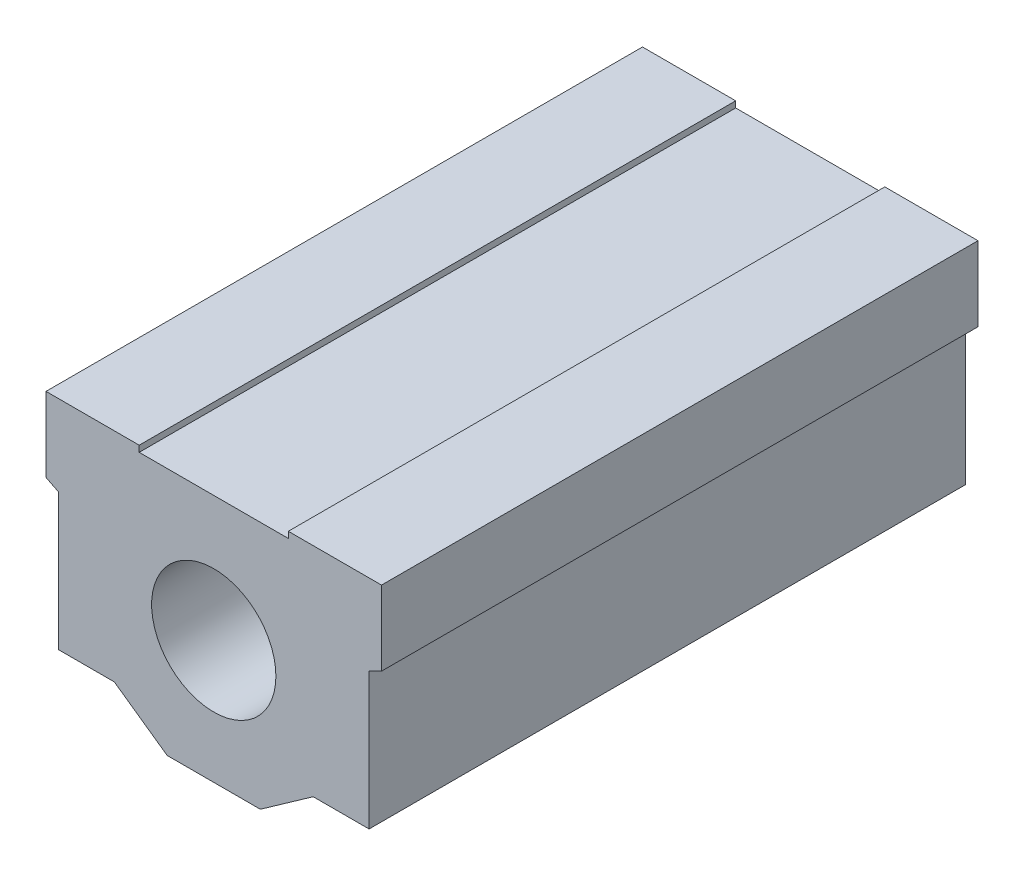
ISO-10303-21;
HEADER;
FILE_DESCRIPTION(('STEP AP214'),'2;1');
FILE_NAME('part.step','',(''),(''),'','','');
FILE_SCHEMA(('AUTOMOTIVE_DESIGN { 1 0 10303 214 1 1 1 1 }'));
ENDSEC;
DATA;
#1=APPLICATION_CONTEXT('core data for automotive mechanical design processes');
#2=APPLICATION_PROTOCOL_DEFINITION('international standard','automotive_design',2000,#1);
#3=PRODUCT_CONTEXT('',#1,'mechanical');
#4=PRODUCT('Part','Part','',(#3));
#5=PRODUCT_RELATED_PRODUCT_CATEGORY('part','',(#4));
#6=PRODUCT_DEFINITION_FORMATION('','',#4);
#7=PRODUCT_DEFINITION_CONTEXT('part definition',#1,'design');
#8=PRODUCT_DEFINITION('design','',#6,#7);
#9=PRODUCT_DEFINITION_SHAPE('','',#8);
#10=(LENGTH_UNIT() NAMED_UNIT(*) SI_UNIT(.MILLI.,.METRE.));
#11=(NAMED_UNIT(*) PLANE_ANGLE_UNIT() SI_UNIT($,.RADIAN.));
#12=(NAMED_UNIT(*) SI_UNIT($,.STERADIAN.) SOLID_ANGLE_UNIT());
#13=UNCERTAINTY_MEASURE_WITH_UNIT(LENGTH_MEASURE(1.E-05),#10,'distance_accuracy_value','');
#14=(GEOMETRIC_REPRESENTATION_CONTEXT(3) GLOBAL_UNCERTAINTY_ASSIGNED_CONTEXT((#13)) GLOBAL_UNIT_ASSIGNED_CONTEXT((#10,
#11,#12)) REPRESENTATION_CONTEXT('',''));
#15=CARTESIAN_POINT('',(0.,0.,0.));
#16=DIRECTION('',(0.,0.,1.));
#17=DIRECTION('',(1.,0.,0.));
#18=AXIS2_PLACEMENT_3D('',#15,#16,#17);
#19=CARTESIAN_POINT('',(0.,0.,96.));
#20=DIRECTION('',(0.,0.,-1.));
#21=DIRECTION('',(-1.,0.,0.));
#22=AXIS2_PLACEMENT_3D('',#19,#20,#21);
#23=PLANE('',#22);
#24=DIRECTION('',(0.816967863264762,-0.576683197598654,0.));
#25=VECTOR('',#24,1.);
#26=CARTESIAN_POINT('',(-7.49999999999999,0.,96.));
#27=LINE('',#26,#25);
#28=CARTESIAN_POINT('',(-16.,5.99999999999999,96.));
#29=VERTEX_POINT('',#28);
#30=CARTESIAN_POINT('',(-7.49999999999999,0.,96.));
#31=VERTEX_POINT('',#30);
#32=EDGE_CURVE('E236',#29,#31,#27,.T.);
#33=ORIENTED_EDGE('',*,*,#32,.T.);
#34=DIRECTION('',(1.,0.,0.));
#35=VECTOR('',#34,1.);
#36=CARTESIAN_POINT('',(7.50000000000001,0.,96.));
#37=LINE('',#36,#35);
#38=CARTESIAN_POINT('',(7.50000000000001,0.,96.));
#39=VERTEX_POINT('',#38);
#40=EDGE_CURVE('E124',#31,#39,#37,.T.);
#41=ORIENTED_EDGE('',*,*,#40,.T.);
#42=DIRECTION('',(0.816967863264762,0.576683197598655,0.));
#43=VECTOR('',#42,1.);
#44=CARTESIAN_POINT('',(7.50000000000001,0.,96.));
#45=LINE('',#44,#43);
#46=CARTESIAN_POINT('',(16.,5.99999999999999,96.));
#47=VERTEX_POINT('',#46);
#48=EDGE_CURVE('E289',#39,#47,#45,.T.);
#49=ORIENTED_EDGE('',*,*,#48,.T.);
#50=DIRECTION('',(1.,0.,0.));
#51=VECTOR('',#50,1.);
#52=CARTESIAN_POINT('',(16.,5.99999999999999,96.));
#53=LINE('',#52,#51);
#54=CARTESIAN_POINT('',(25.,5.99999999999999,96.));
#55=VERTEX_POINT('',#54);
#56=EDGE_CURVE('E309',#47,#55,#53,.T.);
#57=ORIENTED_EDGE('',*,*,#56,.T.);
#58=DIRECTION('',(0.,1.,0.));
#59=VECTOR('',#58,1.);
#60=CARTESIAN_POINT('',(25.,5.99999999999999,96.));
#61=LINE('',#60,#59);
#62=CARTESIAN_POINT('',(25.,28.,96.));
#63=VERTEX_POINT('',#62);
#64=EDGE_CURVE('E305',#55,#63,#61,.T.);
#65=ORIENTED_EDGE('',*,*,#64,.T.);
#66=DIRECTION('',(0.894427190999913,0.447213595499964,0.));
#67=VECTOR('',#66,1.);
#68=CARTESIAN_POINT('',(25.,28.,96.));
#69=LINE('',#68,#67);
#70=CARTESIAN_POINT('',(27.,29.,96.));
#71=VERTEX_POINT('',#70);
#72=EDGE_CURVE('E308',#63,#71,#69,.T.);
#73=ORIENTED_EDGE('',*,*,#72,.T.);
#74=DIRECTION('',(0.,1.,0.));
#75=VECTOR('',#74,1.);
#76=CARTESIAN_POINT('',(27.,29.,96.));
#77=LINE('',#76,#75);
#78=CARTESIAN_POINT('',(27.,41.,96.));
#79=VERTEX_POINT('',#78);
#80=EDGE_CURVE('E313',#71,#79,#77,.T.);
#81=ORIENTED_EDGE('',*,*,#80,.T.);
#82=DIRECTION('',(-1.,0.,0.));
#83=VECTOR('',#82,1.);
#84=CARTESIAN_POINT('',(27.,41.,96.));
#85=LINE('',#84,#83);
#86=CARTESIAN_POINT('',(12.,41.,96.));
#87=VERTEX_POINT('',#86);
#88=EDGE_CURVE('E320',#79,#87,#85,.T.);
#89=ORIENTED_EDGE('',*,*,#88,.T.);
#90=DIRECTION('',(0.,-1.,0.));
#91=VECTOR('',#90,1.);
#92=CARTESIAN_POINT('',(12.,41.,96.));
#93=LINE('',#92,#91);
#94=CARTESIAN_POINT('',(12.,40.,96.));
#95=VERTEX_POINT('',#94);
#96=EDGE_CURVE('E323',#87,#95,#93,.T.);
#97=ORIENTED_EDGE('',*,*,#96,.T.);
#98=DIRECTION('',(-1.,0.,0.));
#99=VECTOR('',#98,1.);
#100=CARTESIAN_POINT('',(-12.,40.,96.));
#101=LINE('',#100,#99);
#102=CARTESIAN_POINT('',(-12.,40.,96.));
#103=VERTEX_POINT('',#102);
#104=EDGE_CURVE('E326',#95,#103,#101,.T.);
#105=ORIENTED_EDGE('',*,*,#104,.T.);
#106=DIRECTION('',(0.,1.,0.));
#107=VECTOR('',#106,1.);
#108=CARTESIAN_POINT('',(-12.,41.,96.));
#109=LINE('',#108,#107);
#110=CARTESIAN_POINT('',(-12.,41.,96.));
#111=VERTEX_POINT('',#110);
#112=EDGE_CURVE('E329',#103,#111,#109,.T.);
#113=ORIENTED_EDGE('',*,*,#112,.T.);
#114=DIRECTION('',(-1.,0.,0.));
#115=VECTOR('',#114,1.);
#116=CARTESIAN_POINT('',(-27.,41.,96.));
#117=LINE('',#116,#115);
#118=CARTESIAN_POINT('',(-27.,41.,96.));
#119=VERTEX_POINT('',#118);
#120=EDGE_CURVE('E332',#111,#119,#117,.T.);
#121=ORIENTED_EDGE('',*,*,#120,.T.);
#122=DIRECTION('',(0.,-1.,0.));
#123=VECTOR('',#122,1.);
#124=CARTESIAN_POINT('',(-27.,29.,96.));
#125=LINE('',#124,#123);
#126=CARTESIAN_POINT('',(-27.,29.,96.));
#127=VERTEX_POINT('',#126);
#128=EDGE_CURVE('E167',#119,#127,#125,.T.);
#129=ORIENTED_EDGE('',*,*,#128,.T.);
#130=DIRECTION('',(0.894427190999913,-0.447213595499964,0.));
#131=VECTOR('',#130,1.);
#132=CARTESIAN_POINT('',(-25.,28.,96.));
#133=LINE('',#132,#131);
#134=CARTESIAN_POINT('',(-25.,28.,96.));
#135=VERTEX_POINT('',#134);
#136=EDGE_CURVE('E161',#127,#135,#133,.T.);
#137=ORIENTED_EDGE('',*,*,#136,.T.);
#138=DIRECTION('',(0.,-1.,0.));
#139=VECTOR('',#138,1.);
#140=CARTESIAN_POINT('',(-25.,5.99999999999999,96.));
#141=LINE('',#140,#139);
#142=CARTESIAN_POINT('',(-25.,5.99999999999999,96.));
#143=VERTEX_POINT('',#142);
#144=EDGE_CURVE('E165',#135,#143,#141,.T.);
#145=ORIENTED_EDGE('',*,*,#144,.T.);
#146=DIRECTION('',(1.,0.,0.));
#147=VECTOR('',#146,1.);
#148=CARTESIAN_POINT('',(-16.,5.99999999999999,96.));
#149=LINE('',#148,#147);
#150=EDGE_CURVE('E57',#143,#29,#149,.T.);
#151=ORIENTED_EDGE('',*,*,#150,.T.);
#152=EDGE_LOOP('',(#33,#41,#49,#57,#65,#73,#81,#89,#97,#105,#113,#121,#129,#137,#145,#151));
#153=FACE_BOUND('',#152,.T.);
#154=CARTESIAN_POINT('',(0.,19.8,96.));
#155=DIRECTION('',(0.,0.,1.));
#156=DIRECTION('',(1.,0.,0.));
#157=AXIS2_PLACEMENT_3D('',#154,#155,#156);
#158=CIRCLE('',#157,10.);
#159=CARTESIAN_POINT('',(10.,19.8,96.));
#160=VERTEX_POINT('',#159);
#161=EDGE_CURVE('E194',#160,#160,#158,.T.);
#162=ORIENTED_EDGE('',*,*,#161,.F.);
#163=EDGE_LOOP('',(#162));
#164=FACE_BOUND('',#163,.T.);
#165=ADVANCED_FACE('F39',(#153,#164),#23,.F.);
#166=CARTESIAN_POINT('',(0.,0.,0.));
#167=DIRECTION('',(0.,0.,-1.));
#168=DIRECTION('',(-1.,0.,0.));
#169=AXIS2_PLACEMENT_3D('',#166,#167,#168);
#170=PLANE('',#169);
#171=DIRECTION('',(0.816967863264762,-0.576683197598654,0.));
#172=VECTOR('',#171,1.);
#173=CARTESIAN_POINT('',(-7.49999999999999,0.,0.));
#174=LINE('',#173,#172);
#175=CARTESIAN_POINT('',(-16.,5.99999999999999,0.));
#176=VERTEX_POINT('',#175);
#177=CARTESIAN_POINT('',(-7.49999999999999,0.,0.));
#178=VERTEX_POINT('',#177);
#179=EDGE_CURVE('E189',#176,#178,#174,.T.);
#180=ORIENTED_EDGE('',*,*,#179,.F.);
#181=DIRECTION('',(1.,0.,0.));
#182=VECTOR('',#181,1.);
#183=CARTESIAN_POINT('',(-16.,5.99999999999999,0.));
#184=LINE('',#183,#182);
#185=CARTESIAN_POINT('',(-25.,5.99999999999999,0.));
#186=VERTEX_POINT('',#185);
#187=EDGE_CURVE('E116',#186,#176,#184,.T.);
#188=ORIENTED_EDGE('',*,*,#187,.F.);
#189=DIRECTION('',(0.,-1.,0.));
#190=VECTOR('',#189,1.);
#191=CARTESIAN_POINT('',(-25.,5.99999999999999,0.));
#192=LINE('',#191,#190);
#193=CARTESIAN_POINT('',(-25.,28.,0.));
#194=VERTEX_POINT('',#193);
#195=EDGE_CURVE('E110',#194,#186,#192,.T.);
#196=ORIENTED_EDGE('',*,*,#195,.F.);
#197=DIRECTION('',(0.894427190999913,-0.447213595499964,0.));
#198=VECTOR('',#197,1.);
#199=CARTESIAN_POINT('',(-25.,28.,0.));
#200=LINE('',#199,#198);
#201=CARTESIAN_POINT('',(-27.,29.,0.));
#202=VERTEX_POINT('',#201);
#203=EDGE_CURVE('E176',#202,#194,#200,.T.);
#204=ORIENTED_EDGE('',*,*,#203,.F.);
#205=DIRECTION('',(0.,-1.,0.));
#206=VECTOR('',#205,1.);
#207=CARTESIAN_POINT('',(-27.,29.,0.));
#208=LINE('',#207,#206);
#209=CARTESIAN_POINT('',(-27.,41.,0.));
#210=VERTEX_POINT('',#209);
#211=EDGE_CURVE('E227',#210,#202,#208,.T.);
#212=ORIENTED_EDGE('',*,*,#211,.F.);
#213=DIRECTION('',(-1.,0.,0.));
#214=VECTOR('',#213,1.);
#215=CARTESIAN_POINT('',(-27.,41.,0.));
#216=LINE('',#215,#214);
#217=CARTESIAN_POINT('',(-12.,41.,0.));
#218=VERTEX_POINT('',#217);
#219=EDGE_CURVE('E224',#218,#210,#216,.T.);
#220=ORIENTED_EDGE('',*,*,#219,.F.);
#221=DIRECTION('',(0.,1.,0.));
#222=VECTOR('',#221,1.);
#223=CARTESIAN_POINT('',(-12.,41.,0.));
#224=LINE('',#223,#222);
#225=CARTESIAN_POINT('',(-12.,40.,0.));
#226=VERTEX_POINT('',#225);
#227=EDGE_CURVE('E221',#226,#218,#224,.T.);
#228=ORIENTED_EDGE('',*,*,#227,.F.);
#229=DIRECTION('',(-1.,0.,0.));
#230=VECTOR('',#229,1.);
#231=CARTESIAN_POINT('',(-12.,40.,0.));
#232=LINE('',#231,#230);
#233=CARTESIAN_POINT('',(12.,40.,0.));
#234=VERTEX_POINT('',#233);
#235=EDGE_CURVE('E218',#234,#226,#232,.T.);
#236=ORIENTED_EDGE('',*,*,#235,.F.);
#237=DIRECTION('',(0.,-1.,0.));
#238=VECTOR('',#237,1.);
#239=CARTESIAN_POINT('',(12.,41.,0.));
#240=LINE('',#239,#238);
#241=CARTESIAN_POINT('',(12.,41.,0.));
#242=VERTEX_POINT('',#241);
#243=EDGE_CURVE('E215',#242,#234,#240,.T.);
#244=ORIENTED_EDGE('',*,*,#243,.F.);
#245=DIRECTION('',(-1.,0.,0.));
#246=VECTOR('',#245,1.);
#247=CARTESIAN_POINT('',(27.,41.,0.));
#248=LINE('',#247,#246);
#249=CARTESIAN_POINT('',(27.,41.,0.));
#250=VERTEX_POINT('',#249);
#251=EDGE_CURVE('E212',#250,#242,#248,.T.);
#252=ORIENTED_EDGE('',*,*,#251,.F.);
#253=DIRECTION('',(0.,1.,0.));
#254=VECTOR('',#253,1.);
#255=CARTESIAN_POINT('',(27.,29.,0.));
#256=LINE('',#255,#254);
#257=CARTESIAN_POINT('',(27.,29.,0.));
#258=VERTEX_POINT('',#257);
#259=EDGE_CURVE('E209',#258,#250,#256,.T.);
#260=ORIENTED_EDGE('',*,*,#259,.F.);
#261=DIRECTION('',(0.894427190999913,0.447213595499964,0.));
#262=VECTOR('',#261,1.);
#263=CARTESIAN_POINT('',(25.,28.,0.));
#264=LINE('',#263,#262);
#265=CARTESIAN_POINT('',(25.,28.,0.));
#266=VERTEX_POINT('',#265);
#267=EDGE_CURVE('E206',#266,#258,#264,.T.);
#268=ORIENTED_EDGE('',*,*,#267,.F.);
#269=DIRECTION('',(0.,1.,0.));
#270=VECTOR('',#269,1.);
#271=CARTESIAN_POINT('',(25.,5.99999999999999,0.));
#272=LINE('',#271,#270);
#273=CARTESIAN_POINT('',(25.,5.99999999999999,0.));
#274=VERTEX_POINT('',#273);
#275=EDGE_CURVE('E203',#274,#266,#272,.T.);
#276=ORIENTED_EDGE('',*,*,#275,.F.);
#277=DIRECTION('',(1.,0.,0.));
#278=VECTOR('',#277,1.);
#279=CARTESIAN_POINT('',(16.,5.99999999999999,0.));
#280=LINE('',#279,#278);
#281=CARTESIAN_POINT('',(16.,5.99999999999999,0.));
#282=VERTEX_POINT('',#281);
#283=EDGE_CURVE('E200',#282,#274,#280,.T.);
#284=ORIENTED_EDGE('',*,*,#283,.F.);
#285=DIRECTION('',(0.816967863264762,0.576683197598655,0.));
#286=VECTOR('',#285,1.);
#287=CARTESIAN_POINT('',(7.50000000000001,0.,0.));
#288=LINE('',#287,#286);
#289=CARTESIAN_POINT('',(7.50000000000001,0.,0.));
#290=VERTEX_POINT('',#289);
#291=EDGE_CURVE('E197',#290,#282,#288,.T.);
#292=ORIENTED_EDGE('',*,*,#291,.F.);
#293=DIRECTION('',(1.,0.,0.));
#294=VECTOR('',#293,1.);
#295=CARTESIAN_POINT('',(7.50000000000001,0.,0.));
#296=LINE('',#295,#294);
#297=EDGE_CURVE('E193',#178,#290,#296,.T.);
#298=ORIENTED_EDGE('',*,*,#297,.F.);
#299=EDGE_LOOP('',(#180,#188,#196,#204,#212,#220,#228,#236,#244,#252,#260,#268,#276,#284,#292,#298));
#300=FACE_BOUND('',#299,.T.);
#301=CARTESIAN_POINT('',(0.,19.8,0.));
#302=DIRECTION('',(0.,0.,1.));
#303=DIRECTION('',(1.,0.,0.));
#304=AXIS2_PLACEMENT_3D('',#301,#302,#303);
#305=CIRCLE('',#304,10.);
#306=CARTESIAN_POINT('',(10.,19.8,0.));
#307=VERTEX_POINT('',#306);
#308=EDGE_CURVE('E533',#307,#307,#305,.T.);
#309=ORIENTED_EDGE('',*,*,#308,.T.);
#310=EDGE_LOOP('',(#309));
#311=FACE_BOUND('',#310,.T.);
#312=ADVANCED_FACE('F293',(#300,#311),#170,.T.);
#313=CARTESIAN_POINT('',(-7.49999999999999,0.,96.));
#314=DIRECTION('',(0.576683197598654,0.816967863264762,0.));
#315=DIRECTION('',(-0.816967863264762,0.576683197598654,0.));
#316=AXIS2_PLACEMENT_3D('',#313,#314,#315);
#317=PLANE('',#316);
#318=ORIENTED_EDGE('',*,*,#179,.T.);
#319=DIRECTION('',(0.,0.,-1.));
#320=VECTOR('',#319,1.);
#321=CARTESIAN_POINT('',(-7.49999999999999,0.,96.));
#322=LINE('',#321,#320);
#323=EDGE_CURVE('E11',#31,#178,#322,.T.);
#324=ORIENTED_EDGE('',*,*,#323,.F.);
#325=ORIENTED_EDGE('',*,*,#32,.F.);
#326=DIRECTION('',(0.,0.,-1.));
#327=VECTOR('',#326,1.);
#328=CARTESIAN_POINT('',(-16.,5.99999999999999,96.));
#329=LINE('',#328,#327);
#330=EDGE_CURVE('E185',#29,#176,#329,.T.);
#331=ORIENTED_EDGE('',*,*,#330,.T.);
#332=EDGE_LOOP('',(#318,#324,#325,#331));
#333=FACE_BOUND('',#332,.T.);
#334=ADVANCED_FACE('F41',(#333),#317,.F.);
#335=CARTESIAN_POINT('',(7.50000000000001,0.,96.));
#336=DIRECTION('',(0.,1.,0.));
#337=DIRECTION('',(-1.,0.,0.));
#338=AXIS2_PLACEMENT_3D('',#335,#336,#337);
#339=PLANE('',#338);
#340=ORIENTED_EDGE('',*,*,#297,.T.);
#341=DIRECTION('',(0.,0.,-1.));
#342=VECTOR('',#341,1.);
#343=CARTESIAN_POINT('',(7.50000000000001,0.,96.));
#344=LINE('',#343,#342);
#345=EDGE_CURVE('E49',#39,#290,#344,.T.);
#346=ORIENTED_EDGE('',*,*,#345,.F.);
#347=ORIENTED_EDGE('',*,*,#40,.F.);
#348=ORIENTED_EDGE('',*,*,#323,.T.);
#349=EDGE_LOOP('',(#340,#346,#347,#348));
#350=FACE_BOUND('',#349,.T.);
#351=ADVANCED_FACE('F368',(#350),#339,.F.);
#352=CARTESIAN_POINT('',(7.50000000000001,0.,96.));
#353=DIRECTION('',(-0.576683197598655,0.816967863264762,0.));
#354=DIRECTION('',(-0.816967863264762,-0.576683197598655,0.));
#355=AXIS2_PLACEMENT_3D('',#352,#353,#354);
#356=PLANE('',#355);
#357=ORIENTED_EDGE('',*,*,#291,.T.);
#358=DIRECTION('',(0.,0.,-1.));
#359=VECTOR('',#358,1.);
#360=CARTESIAN_POINT('',(16.,5.99999999999999,96.));
#361=LINE('',#360,#359);
#362=EDGE_CURVE('E279',#47,#282,#361,.T.);
#363=ORIENTED_EDGE('',*,*,#362,.F.);
#364=ORIENTED_EDGE('',*,*,#48,.F.);
#365=ORIENTED_EDGE('',*,*,#345,.T.);
#366=EDGE_LOOP('',(#357,#363,#364,#365));
#367=FACE_BOUND('',#366,.T.);
#368=ADVANCED_FACE('F287',(#367),#356,.F.);
#369=CARTESIAN_POINT('',(16.,5.99999999999999,96.));
#370=DIRECTION('',(0.,1.,0.));
#371=DIRECTION('',(-1.,0.,0.));
#372=AXIS2_PLACEMENT_3D('',#369,#370,#371);
#373=PLANE('',#372);
#374=ORIENTED_EDGE('',*,*,#283,.T.);
#375=DIRECTION('',(0.,0.,-1.));
#376=VECTOR('',#375,1.);
#377=CARTESIAN_POINT('',(25.,5.99999999999999,96.));
#378=LINE('',#377,#376);
#379=EDGE_CURVE('E275',#55,#274,#378,.T.);
#380=ORIENTED_EDGE('',*,*,#379,.F.);
#381=ORIENTED_EDGE('',*,*,#56,.F.);
#382=ORIENTED_EDGE('',*,*,#362,.T.);
#383=EDGE_LOOP('',(#374,#380,#381,#382));
#384=FACE_BOUND('',#383,.T.);
#385=ADVANCED_FACE('F299',(#384),#373,.F.);
#386=CARTESIAN_POINT('',(25.,5.99999999999999,96.));
#387=DIRECTION('',(-1.,0.,0.));
#388=DIRECTION('',(0.,-1.,0.));
#389=AXIS2_PLACEMENT_3D('',#386,#387,#388);
#390=PLANE('',#389);
#391=ORIENTED_EDGE('',*,*,#275,.T.);
#392=DIRECTION('',(0.,0.,-1.));
#393=VECTOR('',#392,1.);
#394=CARTESIAN_POINT('',(25.,28.,96.));
#395=LINE('',#394,#393);
#396=EDGE_CURVE('E271',#63,#266,#395,.T.);
#397=ORIENTED_EDGE('',*,*,#396,.F.);
#398=ORIENTED_EDGE('',*,*,#64,.F.);
#399=ORIENTED_EDGE('',*,*,#379,.T.);
#400=EDGE_LOOP('',(#391,#397,#398,#399));
#401=FACE_BOUND('',#400,.T.);
#402=ADVANCED_FACE('F303',(#401),#390,.F.);
#403=CARTESIAN_POINT('',(25.,28.,96.));
#404=DIRECTION('',(-0.447213595499964,0.894427190999913,0.));
#405=DIRECTION('',(-0.894427190999913,-0.447213595499964,0.));
#406=AXIS2_PLACEMENT_3D('',#403,#404,#405);
#407=PLANE('',#406);
#408=ORIENTED_EDGE('',*,*,#267,.T.);
#409=DIRECTION('',(0.,0.,-1.));
#410=VECTOR('',#409,1.);
#411=CARTESIAN_POINT('',(27.,29.,96.));
#412=LINE('',#411,#410);
#413=EDGE_CURVE('E267',#71,#258,#412,.T.);
#414=ORIENTED_EDGE('',*,*,#413,.F.);
#415=ORIENTED_EDGE('',*,*,#72,.F.);
#416=ORIENTED_EDGE('',*,*,#396,.T.);
#417=EDGE_LOOP('',(#408,#414,#415,#416));
#418=FACE_BOUND('',#417,.T.);
#419=ADVANCED_FACE('F381',(#418),#407,.F.);
#420=CARTESIAN_POINT('',(27.,29.,96.));
#421=DIRECTION('',(-1.,0.,0.));
#422=DIRECTION('',(0.,0.,1.));
#423=AXIS2_PLACEMENT_3D('',#420,#421,#422);
#424=PLANE('',#423);
#425=ORIENTED_EDGE('',*,*,#259,.T.);
#426=DIRECTION('',(0.,0.,-1.));
#427=VECTOR('',#426,1.);
#428=CARTESIAN_POINT('',(27.,41.,96.));
#429=LINE('',#428,#427);
#430=EDGE_CURVE('E263',#79,#250,#429,.T.);
#431=ORIENTED_EDGE('',*,*,#430,.F.);
#432=ORIENTED_EDGE('',*,*,#80,.F.);
#433=ORIENTED_EDGE('',*,*,#413,.T.);
#434=EDGE_LOOP('',(#425,#431,#432,#433));
#435=FACE_BOUND('',#434,.T.);
#436=ADVANCED_FACE('F384',(#435),#424,.F.);
#437=CARTESIAN_POINT('',(27.,41.,96.));
#438=DIRECTION('',(0.,-1.,0.));
#439=DIRECTION('',(1.,0.,0.));
#440=AXIS2_PLACEMENT_3D('',#437,#438,#439);
#441=PLANE('',#440);
#442=ORIENTED_EDGE('',*,*,#251,.T.);
#443=DIRECTION('',(0.,0.,-1.));
#444=VECTOR('',#443,1.);
#445=CARTESIAN_POINT('',(12.,41.,96.));
#446=LINE('',#445,#444);
#447=EDGE_CURVE('E259',#87,#242,#446,.T.);
#448=ORIENTED_EDGE('',*,*,#447,.F.);
#449=ORIENTED_EDGE('',*,*,#88,.F.);
#450=ORIENTED_EDGE('',*,*,#430,.T.);
#451=EDGE_LOOP('',(#442,#448,#449,#450));
#452=FACE_BOUND('',#451,.T.);
#453=ADVANCED_FACE('F388',(#452),#441,.F.);
#454=CARTESIAN_POINT('',(12.,41.,96.));
#455=DIRECTION('',(1.,0.,0.));
#456=DIRECTION('',(0.,0.,-1.));
#457=AXIS2_PLACEMENT_3D('',#454,#455,#456);
#458=PLANE('',#457);
#459=ORIENTED_EDGE('',*,*,#243,.T.);
#460=DIRECTION('',(0.,0.,-1.));
#461=VECTOR('',#460,1.);
#462=CARTESIAN_POINT('',(12.,40.,96.));
#463=LINE('',#462,#461);
#464=EDGE_CURVE('E255',#95,#234,#463,.T.);
#465=ORIENTED_EDGE('',*,*,#464,.F.);
#466=ORIENTED_EDGE('',*,*,#96,.F.);
#467=ORIENTED_EDGE('',*,*,#447,.T.);
#468=EDGE_LOOP('',(#459,#465,#466,#467));
#469=FACE_BOUND('',#468,.T.);
#470=ADVANCED_FACE('F392',(#469),#458,.F.);
#471=CARTESIAN_POINT('',(-12.,40.,96.));
#472=DIRECTION('',(0.,-1.,0.));
#473=DIRECTION('',(0.,0.,-1.));
#474=AXIS2_PLACEMENT_3D('',#471,#472,#473);
#475=PLANE('',#474);
#476=ORIENTED_EDGE('',*,*,#235,.T.);
#477=DIRECTION('',(0.,0.,-1.));
#478=VECTOR('',#477,1.);
#479=CARTESIAN_POINT('',(-12.,40.,96.));
#480=LINE('',#479,#478);
#481=EDGE_CURVE('E251',#103,#226,#480,.T.);
#482=ORIENTED_EDGE('',*,*,#481,.F.);
#483=ORIENTED_EDGE('',*,*,#104,.F.);
#484=ORIENTED_EDGE('',*,*,#464,.T.);
#485=EDGE_LOOP('',(#476,#482,#483,#484));
#486=FACE_BOUND('',#485,.T.);
#487=ADVANCED_FACE('F396',(#486),#475,.F.);
#488=CARTESIAN_POINT('',(-12.,41.,96.));
#489=DIRECTION('',(-1.,0.,0.));
#490=DIRECTION('',(0.,0.,1.));
#491=AXIS2_PLACEMENT_3D('',#488,#489,#490);
#492=PLANE('',#491);
#493=ORIENTED_EDGE('',*,*,#227,.T.);
#494=DIRECTION('',(0.,0.,-1.));
#495=VECTOR('',#494,1.);
#496=CARTESIAN_POINT('',(-12.,41.,96.));
#497=LINE('',#496,#495);
#498=EDGE_CURVE('E247',#111,#218,#497,.T.);
#499=ORIENTED_EDGE('',*,*,#498,.F.);
#500=ORIENTED_EDGE('',*,*,#112,.F.);
#501=ORIENTED_EDGE('',*,*,#481,.T.);
#502=EDGE_LOOP('',(#493,#499,#500,#501));
#503=FACE_BOUND('',#502,.T.);
#504=ADVANCED_FACE('F400',(#503),#492,.F.);
#505=CARTESIAN_POINT('',(-27.,41.,96.));
#506=DIRECTION('',(0.,-1.,0.));
#507=DIRECTION('',(0.,0.,-1.));
#508=AXIS2_PLACEMENT_3D('',#505,#506,#507);
#509=PLANE('',#508);
#510=ORIENTED_EDGE('',*,*,#219,.T.);
#511=DIRECTION('',(0.,0.,-1.));
#512=VECTOR('',#511,1.);
#513=CARTESIAN_POINT('',(-27.,41.,96.));
#514=LINE('',#513,#512);
#515=EDGE_CURVE('E243',#119,#210,#514,.T.);
#516=ORIENTED_EDGE('',*,*,#515,.F.);
#517=ORIENTED_EDGE('',*,*,#120,.F.);
#518=ORIENTED_EDGE('',*,*,#498,.T.);
#519=EDGE_LOOP('',(#510,#516,#517,#518));
#520=FACE_BOUND('',#519,.T.);
#521=ADVANCED_FACE('F340',(#520),#509,.F.);
#522=CARTESIAN_POINT('',(-27.,29.,96.));
#523=DIRECTION('',(1.,0.,0.));
#524=DIRECTION('',(0.,0.,-1.));
#525=AXIS2_PLACEMENT_3D('',#522,#523,#524);
#526=PLANE('',#525);
#527=ORIENTED_EDGE('',*,*,#211,.T.);
#528=DIRECTION('',(0.,0.,-1.));
#529=VECTOR('',#528,1.);
#530=CARTESIAN_POINT('',(-27.,29.,96.));
#531=LINE('',#530,#529);
#532=EDGE_CURVE('E178',#127,#202,#531,.T.);
#533=ORIENTED_EDGE('',*,*,#532,.F.);
#534=ORIENTED_EDGE('',*,*,#128,.F.);
#535=ORIENTED_EDGE('',*,*,#515,.T.);
#536=EDGE_LOOP('',(#527,#533,#534,#535));
#537=FACE_BOUND('',#536,.T.);
#538=ADVANCED_FACE('F344',(#537),#526,.F.);
#539=CARTESIAN_POINT('',(-25.,28.,96.));
#540=DIRECTION('',(0.447213595499964,0.894427190999913,0.));
#541=DIRECTION('',(-0.894427190999913,0.447213595499964,0.));
#542=AXIS2_PLACEMENT_3D('',#539,#540,#541);
#543=PLANE('',#542);
#544=ORIENTED_EDGE('',*,*,#203,.T.);
#545=DIRECTION('',(0.,0.,-1.));
#546=VECTOR('',#545,1.);
#547=CARTESIAN_POINT('',(-25.,28.,96.));
#548=LINE('',#547,#546);
#549=EDGE_CURVE('E173',#135,#194,#548,.T.);
#550=ORIENTED_EDGE('',*,*,#549,.F.);
#551=ORIENTED_EDGE('',*,*,#136,.F.);
#552=ORIENTED_EDGE('',*,*,#532,.T.);
#553=EDGE_LOOP('',(#544,#550,#551,#552));
#554=FACE_BOUND('',#553,.T.);
#555=ADVANCED_FACE('F174',(#554),#543,.F.);
#556=CARTESIAN_POINT('',(-25.,5.99999999999999,96.));
#557=DIRECTION('',(1.,0.,0.));
#558=DIRECTION('',(0.,0.,-1.));
#559=AXIS2_PLACEMENT_3D('',#556,#557,#558);
#560=PLANE('',#559);
#561=ORIENTED_EDGE('',*,*,#195,.T.);
#562=DIRECTION('',(0.,0.,-1.));
#563=VECTOR('',#562,1.);
#564=CARTESIAN_POINT('',(-25.,5.99999999999999,96.));
#565=LINE('',#564,#563);
#566=EDGE_CURVE('E179',#143,#186,#565,.T.);
#567=ORIENTED_EDGE('',*,*,#566,.F.);
#568=ORIENTED_EDGE('',*,*,#144,.F.);
#569=ORIENTED_EDGE('',*,*,#549,.T.);
#570=EDGE_LOOP('',(#561,#567,#568,#569));
#571=FACE_BOUND('',#570,.T.);
#572=ADVANCED_FACE('F181',(#571),#560,.F.);
#573=CARTESIAN_POINT('',(-16.,5.99999999999999,96.));
#574=DIRECTION('',(0.,1.,0.));
#575=DIRECTION('',(-1.,0.,0.));
#576=AXIS2_PLACEMENT_3D('',#573,#574,#575);
#577=PLANE('',#576);
#578=ORIENTED_EDGE('',*,*,#187,.T.);
#579=ORIENTED_EDGE('',*,*,#330,.F.);
#580=ORIENTED_EDGE('',*,*,#150,.F.);
#581=ORIENTED_EDGE('',*,*,#566,.T.);
#582=EDGE_LOOP('',(#578,#579,#580,#581));
#583=FACE_BOUND('',#582,.T.);
#584=ADVANCED_FACE('F348',(#583),#577,.F.);
#585=CARTESIAN_POINT('',(0.,19.8,96.));
#586=DIRECTION('',(0.,0.,-1.));
#587=DIRECTION('',(-1.,0.,0.));
#588=AXIS2_PLACEMENT_3D('',#585,#586,#587);
#589=CYLINDRICAL_SURFACE('',#588,10.);
#590=ORIENTED_EDGE('',*,*,#161,.T.);
#591=EDGE_LOOP('',(#590));
#592=FACE_BOUND('',#591,.T.);
#593=ORIENTED_EDGE('',*,*,#308,.F.);
#594=EDGE_LOOP('',(#593));
#595=FACE_BOUND('',#594,.T.);
#596=ADVANCED_FACE('F350',(#592,#595),#589,.F.);
#597=CLOSED_SHELL('',(#165,#312,#334,#351,#368,#385,#402,#419,#436,#453,#470,#487,#504,#521,
#538,#555,#572,#584,#596));
#598=MANIFOLD_SOLID_BREP('B2',#597);
#599=ADVANCED_BREP_SHAPE_REPRESENTATION('',(#18,#598),#14);
#600=SHAPE_DEFINITION_REPRESENTATION(#9,#599);
ENDSEC;
END-ISO-10303-21;
